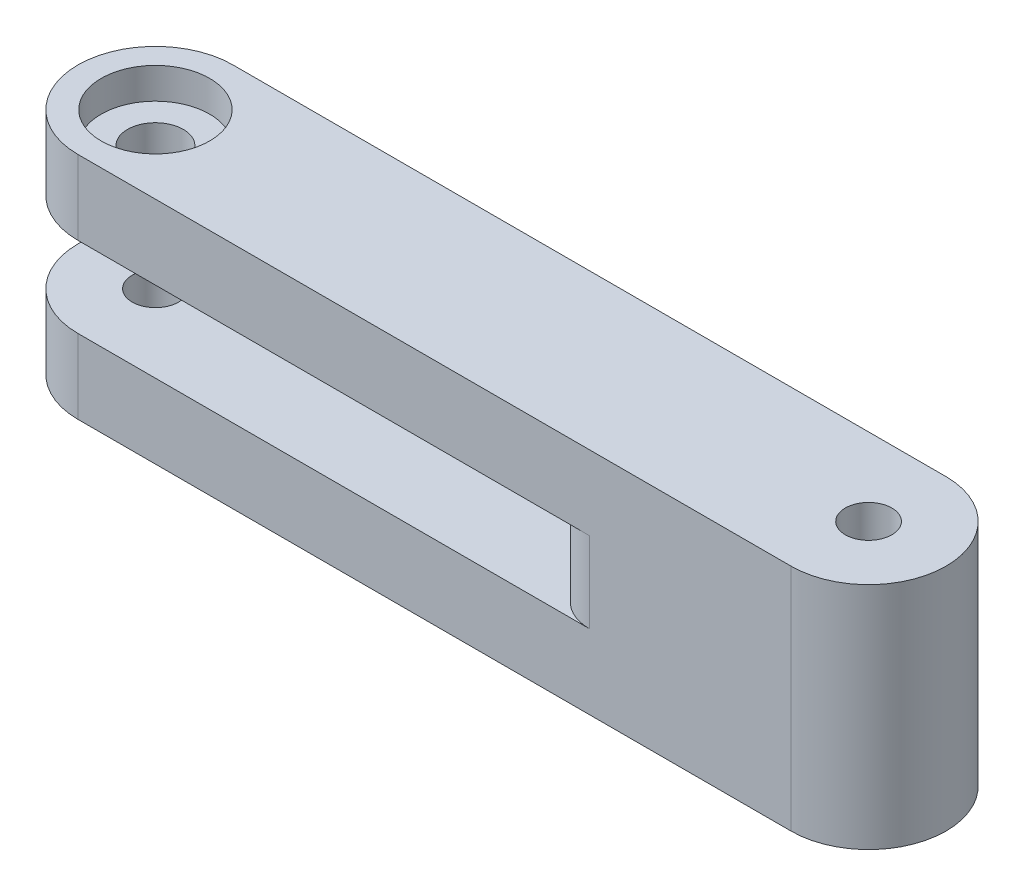
ISO-10303-21;
HEADER;
FILE_DESCRIPTION(('STEP AP214'),'2;1');
FILE_NAME('part.step','',(''),(''),'','','');
FILE_SCHEMA(('AUTOMOTIVE_DESIGN { 1 0 10303 214 1 1 1 1 }'));
ENDSEC;
DATA;
#1=APPLICATION_CONTEXT('core data for automotive mechanical design processes');
#2=APPLICATION_PROTOCOL_DEFINITION('international standard','automotive_design',2000,#1);
#3=PRODUCT_CONTEXT('',#1,'mechanical');
#4=PRODUCT('Part','Part','',(#3));
#5=PRODUCT_RELATED_PRODUCT_CATEGORY('part','',(#4));
#6=PRODUCT_DEFINITION_FORMATION('','',#4);
#7=PRODUCT_DEFINITION_CONTEXT('part definition',#1,'design');
#8=PRODUCT_DEFINITION('design','',#6,#7);
#9=PRODUCT_DEFINITION_SHAPE('','',#8);
#10=(LENGTH_UNIT() NAMED_UNIT(*) SI_UNIT(.MILLI.,.METRE.));
#11=(NAMED_UNIT(*) PLANE_ANGLE_UNIT() SI_UNIT($,.RADIAN.));
#12=(NAMED_UNIT(*) SI_UNIT($,.STERADIAN.) SOLID_ANGLE_UNIT());
#13=UNCERTAINTY_MEASURE_WITH_UNIT(LENGTH_MEASURE(1.E-05),#10,'distance_accuracy_value','');
#14=(GEOMETRIC_REPRESENTATION_CONTEXT(3) GLOBAL_UNCERTAINTY_ASSIGNED_CONTEXT((#13)) GLOBAL_UNIT_ASSIGNED_CONTEXT((#10,
#11,#12)) REPRESENTATION_CONTEXT('',''));
#15=CARTESIAN_POINT('',(0.,0.,0.));
#16=DIRECTION('',(0.,0.,1.));
#17=DIRECTION('',(1.,0.,0.));
#18=AXIS2_PLACEMENT_3D('',#15,#16,#17);
#19=CARTESIAN_POINT('',(-29.21,18.796,0.));
#20=DIRECTION('',(0.,-1.,0.));
#21=DIRECTION('',(0.,0.,-1.));
#22=AXIS2_PLACEMENT_3D('',#19,#20,#21);
#23=CYLINDRICAL_SURFACE('',#22,2.28600000000001);
#24=CARTESIAN_POINT('',(-29.21,12.7,0.));
#25=DIRECTION('',(0.,1.,0.));
#26=DIRECTION('',(0.,0.,1.));
#27=AXIS2_PLACEMENT_3D('',#24,#25,#26);
#28=CIRCLE('',#27,2.28600000000001);
#29=CARTESIAN_POINT('',(-29.21,12.7,2.28600000000001));
#30=VERTEX_POINT('',#29);
#31=EDGE_CURVE('E127',#30,#30,#28,.T.);
#32=ORIENTED_EDGE('',*,*,#31,.F.);
#33=EDGE_LOOP('',(#32));
#34=FACE_BOUND('',#33,.T.);
#35=CARTESIAN_POINT('',(-29.21,16.256,0.));
#36=DIRECTION('',(0.,1.,0.));
#37=DIRECTION('',(0.,0.,1.));
#38=AXIS2_PLACEMENT_3D('',#35,#36,#37);
#39=CIRCLE('',#38,2.28600000000001);
#40=CARTESIAN_POINT('',(-29.21,16.256,2.28600000000001));
#41=VERTEX_POINT('',#40);
#42=EDGE_CURVE('E137',#41,#41,#39,.T.);
#43=ORIENTED_EDGE('',*,*,#42,.T.);
#44=EDGE_LOOP('',(#43));
#45=FACE_BOUND('',#44,.T.);
#46=ADVANCED_FACE('F42',(#34,#45),#23,.F.);
#47=CARTESIAN_POINT('',(-29.21,18.796,0.));
#48=DIRECTION('',(0.,-1.,0.));
#49=DIRECTION('',(0.,0.,-1.));
#50=AXIS2_PLACEMENT_3D('',#47,#48,#49);
#51=CYLINDRICAL_SURFACE('',#50,6.35);
#52=DIRECTION('',(0.,-1.,0.));
#53=VECTOR('',#52,1.);
#54=CARTESIAN_POINT('',(-29.21,18.796,-6.35));
#55=LINE('',#54,#53);
#56=CARTESIAN_POINT('',(-29.21,18.796,-6.35));
#57=VERTEX_POINT('',#56);
#58=CARTESIAN_POINT('',(-29.21,12.7,-6.35000000000001));
#59=VERTEX_POINT('',#58);
#60=EDGE_CURVE('E240',#57,#59,#55,.T.);
#61=ORIENTED_EDGE('',*,*,#60,.T.);
#62=CARTESIAN_POINT('',(-29.21,12.7,0.));
#63=DIRECTION('',(0.,1.,0.));
#64=DIRECTION('',(0.,0.,1.));
#65=AXIS2_PLACEMENT_3D('',#62,#63,#64);
#66=CIRCLE('',#65,6.35);
#67=CARTESIAN_POINT('',(-29.21,12.7,6.34999999999999));
#68=VERTEX_POINT('',#67);
#69=EDGE_CURVE('E158',#59,#68,#66,.T.);
#70=ORIENTED_EDGE('',*,*,#69,.T.);
#71=DIRECTION('',(0.,-1.,0.));
#72=VECTOR('',#71,1.);
#73=CARTESIAN_POINT('',(-29.21,18.796,6.35));
#74=LINE('',#73,#72);
#75=CARTESIAN_POINT('',(-29.21,18.796,6.35));
#76=VERTEX_POINT('',#75);
#77=EDGE_CURVE('E144',#76,#68,#74,.T.);
#78=ORIENTED_EDGE('',*,*,#77,.F.);
#79=CARTESIAN_POINT('',(-29.21,18.796,0.));
#80=DIRECTION('',(0.,1.,0.));
#81=DIRECTION('',(0.,0.,1.));
#82=AXIS2_PLACEMENT_3D('',#79,#80,#81);
#83=CIRCLE('',#82,6.35);
#84=EDGE_CURVE('E214',#57,#76,#83,.T.);
#85=ORIENTED_EDGE('',*,*,#84,.F.);
#86=EDGE_LOOP('',(#61,#70,#78,#85));
#87=FACE_BOUND('',#86,.T.);
#88=ADVANCED_FACE('F265',(#87),#51,.T.);
#89=CARTESIAN_POINT('',(-29.21,18.796,0.));
#90=DIRECTION('',(0.,1.,0.));
#91=DIRECTION('',(0.,0.,1.));
#92=AXIS2_PLACEMENT_3D('',#89,#90,#91);
#93=PLANE('',#92);
#94=CARTESIAN_POINT('',(-29.21,18.796,0.));
#95=DIRECTION('',(0.,1.,0.));
#96=DIRECTION('',(0.,0.,1.));
#97=AXIS2_PLACEMENT_3D('',#94,#95,#96);
#98=CIRCLE('',#97,4.445);
#99=CARTESIAN_POINT('',(-29.21,18.796,4.445));
#100=VERTEX_POINT('',#99);
#101=EDGE_CURVE('E461',#100,#100,#98,.T.);
#102=ORIENTED_EDGE('',*,*,#101,.F.);
#103=EDGE_LOOP('',(#102));
#104=FACE_BOUND('',#103,.T.);
#105=ORIENTED_EDGE('',*,*,#84,.T.);
#106=DIRECTION('',(1.,0.,0.));
#107=VECTOR('',#106,1.);
#108=CARTESIAN_POINT('',(-29.21,18.796,6.35));
#109=LINE('',#108,#107);
#110=CARTESIAN_POINT('',(29.21,18.796,6.34999999999999));
#111=VERTEX_POINT('',#110);
#112=EDGE_CURVE('E218',#76,#111,#109,.T.);
#113=ORIENTED_EDGE('',*,*,#112,.T.);
#114=CARTESIAN_POINT('',(29.21,18.796,0.));
#115=DIRECTION('',(0.,1.,0.));
#116=DIRECTION('',(0.,0.,1.));
#117=AXIS2_PLACEMENT_3D('',#114,#115,#116);
#118=CIRCLE('',#117,6.35);
#119=CARTESIAN_POINT('',(29.21,18.796,-6.35000000000001));
#120=VERTEX_POINT('',#119);
#121=EDGE_CURVE('E222',#111,#120,#118,.T.);
#122=ORIENTED_EDGE('',*,*,#121,.T.);
#123=DIRECTION('',(-1.,0.,0.));
#124=VECTOR('',#123,1.);
#125=CARTESIAN_POINT('',(-29.21,18.796,-6.35));
#126=LINE('',#125,#124);
#127=EDGE_CURVE('E225',#120,#57,#126,.T.);
#128=ORIENTED_EDGE('',*,*,#127,.T.);
#129=EDGE_LOOP('',(#105,#113,#122,#128));
#130=FACE_BOUND('',#129,.T.);
#131=CARTESIAN_POINT('',(29.21,18.796,0.));
#132=DIRECTION('',(0.,1.,0.));
#133=DIRECTION('',(0.,0.,1.));
#134=AXIS2_PLACEMENT_3D('',#131,#132,#133);
#135=CIRCLE('',#134,1.905);
#136=CARTESIAN_POINT('',(29.21,18.796,1.90499999999999));
#137=VERTEX_POINT('',#136);
#138=EDGE_CURVE('E207',#137,#137,#135,.T.);
#139=ORIENTED_EDGE('',*,*,#138,.F.);
#140=EDGE_LOOP('',(#139));
#141=FACE_BOUND('',#140,.T.);
#142=ADVANCED_FACE('F260',(#104,#130,#141),#93,.T.);
#143=CARTESIAN_POINT('',(-29.21,0.,0.));
#144=DIRECTION('',(0.,1.,0.));
#145=DIRECTION('',(0.,0.,1.));
#146=AXIS2_PLACEMENT_3D('',#143,#144,#145);
#147=PLANE('',#146);
#148=CARTESIAN_POINT('',(-29.21,0.,0.));
#149=DIRECTION('',(0.,1.,0.));
#150=DIRECTION('',(0.,0.,1.));
#151=AXIS2_PLACEMENT_3D('',#148,#149,#150);
#152=CIRCLE('',#151,6.35);
#153=CARTESIAN_POINT('',(-29.21,0.,-6.35));
#154=VERTEX_POINT('',#153);
#155=CARTESIAN_POINT('',(-29.21,0.,6.35));
#156=VERTEX_POINT('',#155);
#157=EDGE_CURVE('E142',#154,#156,#152,.T.);
#158=ORIENTED_EDGE('',*,*,#157,.F.);
#159=DIRECTION('',(-1.,0.,0.));
#160=VECTOR('',#159,1.);
#161=CARTESIAN_POINT('',(-29.21,0.,-6.35));
#162=LINE('',#161,#160);
#163=CARTESIAN_POINT('',(29.21,0.,-6.35000000000001));
#164=VERTEX_POINT('',#163);
#165=EDGE_CURVE('E219',#164,#154,#162,.T.);
#166=ORIENTED_EDGE('',*,*,#165,.F.);
#167=CARTESIAN_POINT('',(29.21,0.,0.));
#168=DIRECTION('',(0.,1.,0.));
#169=DIRECTION('',(0.,0.,1.));
#170=AXIS2_PLACEMENT_3D('',#167,#168,#169);
#171=CIRCLE('',#170,6.35);
#172=CARTESIAN_POINT('',(29.21,0.,6.34999999999999));
#173=VERTEX_POINT('',#172);
#174=EDGE_CURVE('E234',#173,#164,#171,.T.);
#175=ORIENTED_EDGE('',*,*,#174,.F.);
#176=DIRECTION('',(1.,0.,0.));
#177=VECTOR('',#176,1.);
#178=CARTESIAN_POINT('',(-29.21,0.,6.35));
#179=LINE('',#178,#177);
#180=EDGE_CURVE('E231',#156,#173,#179,.T.);
#181=ORIENTED_EDGE('',*,*,#180,.F.);
#182=EDGE_LOOP('',(#158,#166,#175,#181));
#183=FACE_BOUND('',#182,.T.);
#184=CARTESIAN_POINT('',(29.21,0.,0.));
#185=DIRECTION('',(0.,1.,0.));
#186=DIRECTION('',(0.,0.,1.));
#187=AXIS2_PLACEMENT_3D('',#184,#185,#186);
#188=CIRCLE('',#187,1.905);
#189=CARTESIAN_POINT('',(29.21,0.,1.90499999999999));
#190=VERTEX_POINT('',#189);
#191=EDGE_CURVE('E206',#190,#190,#188,.T.);
#192=ORIENTED_EDGE('',*,*,#191,.T.);
#193=EDGE_LOOP('',(#192));
#194=FACE_BOUND('',#193,.T.);
#195=CARTESIAN_POINT('',(-29.21,0.,0.));
#196=DIRECTION('',(0.,1.,0.));
#197=DIRECTION('',(0.,0.,1.));
#198=AXIS2_PLACEMENT_3D('',#195,#196,#197);
#199=CIRCLE('',#198,1.905);
#200=CARTESIAN_POINT('',(-29.21,0.,1.905));
#201=VERTEX_POINT('',#200);
#202=EDGE_CURVE('E465',#201,#201,#199,.F.);
#203=ORIENTED_EDGE('',*,*,#202,.F.);
#204=EDGE_LOOP('',(#203));
#205=FACE_BOUND('',#204,.T.);
#206=ADVANCED_FACE('F255',(#183,#194,#205),#147,.F.);
#207=CARTESIAN_POINT('',(-29.21,6.096,6.34999999999999));
#208=VERTEX_POINT('',#207);
#209=EDGE_CURVE('E131',#208,#156,#74,.T.);
#210=ORIENTED_EDGE('',*,*,#209,.F.);
#211=CARTESIAN_POINT('',(-29.21,6.096,0.));
#212=DIRECTION('',(0.,-1.,0.));
#213=DIRECTION('',(1.,0.,0.));
#214=AXIS2_PLACEMENT_3D('',#211,#212,#213);
#215=CIRCLE('',#214,6.35);
#216=CARTESIAN_POINT('',(-29.21,6.096,-6.35000000000001));
#217=VERTEX_POINT('',#216);
#218=EDGE_CURVE('E118',#208,#217,#215,.T.);
#219=ORIENTED_EDGE('',*,*,#218,.T.);
#220=EDGE_CURVE('E228',#217,#154,#55,.T.);
#221=ORIENTED_EDGE('',*,*,#220,.T.);
#222=ORIENTED_EDGE('',*,*,#157,.T.);
#223=EDGE_LOOP('',(#210,#219,#221,#222));
#224=FACE_BOUND('',#223,.T.);
#225=ADVANCED_FACE('F140',(#224),#51,.T.);
#226=CARTESIAN_POINT('',(-29.21,18.796,6.35));
#227=DIRECTION('',(0.,0.,-1.));
#228=DIRECTION('',(-1.,0.,0.));
#229=AXIS2_PLACEMENT_3D('',#226,#227,#228);
#230=PLANE('',#229);
#231=DIRECTION('',(-1.,0.,0.));
#232=VECTOR('',#231,1.);
#233=CARTESIAN_POINT('',(-35.56,12.7,6.34999999999999));
#234=LINE('',#233,#232);
#235=CARTESIAN_POINT('',(12.7,12.7,6.34999999999999));
#236=VERTEX_POINT('',#235);
#237=EDGE_CURVE('E58',#236,#68,#234,.T.);
#238=ORIENTED_EDGE('',*,*,#237,.F.);
#239=DIRECTION('',(0.,1.,0.));
#240=VECTOR('',#239,1.);
#241=CARTESIAN_POINT('',(12.7,18.796,6.34999999999999));
#242=LINE('',#241,#240);
#243=CARTESIAN_POINT('',(12.7,6.096,6.34999999999999));
#244=VERTEX_POINT('',#243);
#245=EDGE_CURVE('E134',#236,#244,#242,.F.);
#246=ORIENTED_EDGE('',*,*,#245,.T.);
#247=DIRECTION('',(1.,0.,0.));
#248=VECTOR('',#247,1.);
#249=CARTESIAN_POINT('',(-35.56,6.096,6.34999999999999));
#250=LINE('',#249,#248);
#251=EDGE_CURVE('E65',#208,#244,#250,.T.);
#252=ORIENTED_EDGE('',*,*,#251,.F.);
#253=ORIENTED_EDGE('',*,*,#209,.T.);
#254=ORIENTED_EDGE('',*,*,#180,.T.);
#255=DIRECTION('',(0.,-1.,0.));
#256=VECTOR('',#255,1.);
#257=CARTESIAN_POINT('',(29.21,18.796,6.34999999999999));
#258=LINE('',#257,#256);
#259=EDGE_CURVE('E145',#111,#173,#258,.T.);
#260=ORIENTED_EDGE('',*,*,#259,.F.);
#261=ORIENTED_EDGE('',*,*,#112,.F.);
#262=ORIENTED_EDGE('',*,*,#77,.T.);
#263=EDGE_LOOP('',(#238,#246,#252,#253,#254,#260,#261,#262));
#264=FACE_BOUND('',#263,.T.);
#265=ADVANCED_FACE('F130',(#264),#230,.F.);
#266=CARTESIAN_POINT('',(29.21,18.796,0.));
#267=DIRECTION('',(0.,-1.,0.));
#268=DIRECTION('',(0.,0.,-1.));
#269=AXIS2_PLACEMENT_3D('',#266,#267,#268);
#270=CYLINDRICAL_SURFACE('',#269,6.35);
#271=ORIENTED_EDGE('',*,*,#174,.T.);
#272=DIRECTION('',(0.,-1.,0.));
#273=VECTOR('',#272,1.);
#274=CARTESIAN_POINT('',(29.21,18.796,-6.35000000000001));
#275=LINE('',#274,#273);
#276=EDGE_CURVE('E151',#120,#164,#275,.T.);
#277=ORIENTED_EDGE('',*,*,#276,.F.);
#278=ORIENTED_EDGE('',*,*,#121,.F.);
#279=ORIENTED_EDGE('',*,*,#259,.T.);
#280=EDGE_LOOP('',(#271,#277,#278,#279));
#281=FACE_BOUND('',#280,.T.);
#282=ADVANCED_FACE('F258',(#281),#270,.T.);
#283=CARTESIAN_POINT('',(-29.21,18.796,-6.35));
#284=DIRECTION('',(0.,0.,1.));
#285=DIRECTION('',(1.,0.,0.));
#286=AXIS2_PLACEMENT_3D('',#283,#284,#285);
#287=PLANE('',#286);
#288=DIRECTION('',(0.,1.,0.));
#289=VECTOR('',#288,1.);
#290=CARTESIAN_POINT('',(12.7,18.796,-6.35000000000001));
#291=LINE('',#290,#289);
#292=CARTESIAN_POINT('',(12.7,6.096,-6.35000000000001));
#293=VERTEX_POINT('',#292);
#294=CARTESIAN_POINT('',(12.7,12.7,-6.35000000000001));
#295=VERTEX_POINT('',#294);
#296=EDGE_CURVE('E149',#293,#295,#291,.T.);
#297=ORIENTED_EDGE('',*,*,#296,.T.);
#298=DIRECTION('',(-1.,0.,0.));
#299=VECTOR('',#298,1.);
#300=CARTESIAN_POINT('',(-35.56,12.7,-6.35000000000001));
#301=LINE('',#300,#299);
#302=EDGE_CURVE('E195',#295,#59,#301,.T.);
#303=ORIENTED_EDGE('',*,*,#302,.T.);
#304=ORIENTED_EDGE('',*,*,#60,.F.);
#305=ORIENTED_EDGE('',*,*,#127,.F.);
#306=ORIENTED_EDGE('',*,*,#276,.T.);
#307=ORIENTED_EDGE('',*,*,#165,.T.);
#308=ORIENTED_EDGE('',*,*,#220,.F.);
#309=DIRECTION('',(1.,0.,0.));
#310=VECTOR('',#309,1.);
#311=CARTESIAN_POINT('',(-35.56,6.096,-6.35000000000001));
#312=LINE('',#311,#310);
#313=EDGE_CURVE('E122',#217,#293,#312,.T.);
#314=ORIENTED_EDGE('',*,*,#313,.T.);
#315=EDGE_LOOP('',(#297,#303,#304,#305,#306,#307,#308,#314));
#316=FACE_BOUND('',#315,.T.);
#317=ADVANCED_FACE('F249',(#316),#287,.F.);
#318=CARTESIAN_POINT('',(29.21,18.796,0.));
#319=DIRECTION('',(0.,-1.,0.));
#320=DIRECTION('',(0.,0.,-1.));
#321=AXIS2_PLACEMENT_3D('',#318,#319,#320);
#322=CYLINDRICAL_SURFACE('',#321,1.905);
#323=ORIENTED_EDGE('',*,*,#138,.T.);
#324=EDGE_LOOP('',(#323));
#325=FACE_BOUND('',#324,.T.);
#326=ORIENTED_EDGE('',*,*,#191,.F.);
#327=EDGE_LOOP('',(#326));
#328=FACE_BOUND('',#327,.T.);
#329=ADVANCED_FACE('F290',(#325,#328),#322,.F.);
#330=CARTESIAN_POINT('',(-35.56,12.7,-6.35000000000001));
#331=DIRECTION('',(0.,1.,0.));
#332=DIRECTION('',(0.,0.,1.));
#333=AXIS2_PLACEMENT_3D('',#330,#331,#332);
#334=PLANE('',#333);
#335=ORIENTED_EDGE('',*,*,#31,.T.);
#336=EDGE_LOOP('',(#335));
#337=FACE_BOUND('',#336,.T.);
#338=ORIENTED_EDGE('',*,*,#302,.F.);
#339=CARTESIAN_POINT('',(12.7,12.7,-2.54000000000001));
#340=DIRECTION('',(0.,1.,0.));
#341=DIRECTION('',(0.,0.,1.));
#342=AXIS2_PLACEMENT_3D('',#339,#340,#341);
#343=CIRCLE('',#342,3.81);
#344=CARTESIAN_POINT('',(8.89,12.7,-2.54000000000001));
#345=VERTEX_POINT('',#344);
#346=EDGE_CURVE('E175',#295,#345,#343,.T.);
#347=ORIENTED_EDGE('',*,*,#346,.T.);
#348=DIRECTION('',(0.,0.,1.));
#349=VECTOR('',#348,1.);
#350=CARTESIAN_POINT('',(8.89,12.7,-6.35000000000001));
#351=LINE('',#350,#349);
#352=CARTESIAN_POINT('',(8.89,12.7,2.53999999999999));
#353=VERTEX_POINT('',#352);
#354=EDGE_CURVE('E128',#345,#353,#351,.T.);
#355=ORIENTED_EDGE('',*,*,#354,.T.);
#356=CARTESIAN_POINT('',(12.7,12.7,2.53999999999999));
#357=DIRECTION('',(0.,1.,0.));
#358=DIRECTION('',(0.,0.,1.));
#359=AXIS2_PLACEMENT_3D('',#356,#357,#358);
#360=CIRCLE('',#359,3.81);
#361=EDGE_CURVE('E51',#353,#236,#360,.T.);
#362=ORIENTED_EDGE('',*,*,#361,.T.);
#363=ORIENTED_EDGE('',*,*,#237,.T.);
#364=ORIENTED_EDGE('',*,*,#69,.F.);
#365=EDGE_LOOP('',(#338,#347,#355,#362,#363,#364));
#366=FACE_BOUND('',#365,.T.);
#367=ADVANCED_FACE('F183',(#337,#366),#334,.F.);
#368=CARTESIAN_POINT('',(-35.56,6.096,-6.35000000000001));
#369=DIRECTION('',(0.,-1.,0.));
#370=DIRECTION('',(1.,0.,0.));
#371=AXIS2_PLACEMENT_3D('',#368,#369,#370);
#372=PLANE('',#371);
#373=ORIENTED_EDGE('',*,*,#251,.T.);
#374=CARTESIAN_POINT('',(12.7,6.096,2.53999999999999));
#375=DIRECTION('',(0.,-1.,0.));
#376=DIRECTION('',(1.,0.,0.));
#377=AXIS2_PLACEMENT_3D('',#374,#375,#376);
#378=CIRCLE('',#377,3.81);
#379=CARTESIAN_POINT('',(8.89,6.096,2.53999999999999));
#380=VERTEX_POINT('',#379);
#381=EDGE_CURVE('E11',#244,#380,#378,.T.);
#382=ORIENTED_EDGE('',*,*,#381,.T.);
#383=DIRECTION('',(0.,0.,1.));
#384=VECTOR('',#383,1.);
#385=CARTESIAN_POINT('',(8.89,6.096,-6.35000000000001));
#386=LINE('',#385,#384);
#387=CARTESIAN_POINT('',(8.89,6.096,-2.54000000000001));
#388=VERTEX_POINT('',#387);
#389=EDGE_CURVE('E189',#388,#380,#386,.T.);
#390=ORIENTED_EDGE('',*,*,#389,.F.);
#391=CARTESIAN_POINT('',(12.7,6.096,-2.54000000000001));
#392=DIRECTION('',(0.,-1.,0.));
#393=DIRECTION('',(1.,0.,0.));
#394=AXIS2_PLACEMENT_3D('',#391,#392,#393);
#395=CIRCLE('',#394,3.81);
#396=EDGE_CURVE('E178',#388,#293,#395,.T.);
#397=ORIENTED_EDGE('',*,*,#396,.T.);
#398=ORIENTED_EDGE('',*,*,#313,.F.);
#399=ORIENTED_EDGE('',*,*,#218,.F.);
#400=EDGE_LOOP('',(#373,#382,#390,#397,#398,#399));
#401=FACE_BOUND('',#400,.T.);
#402=CARTESIAN_POINT('',(-29.21,6.096,0.));
#403=DIRECTION('',(0.,1.,0.));
#404=DIRECTION('',(-1.,0.,0.));
#405=AXIS2_PLACEMENT_3D('',#402,#403,#404);
#406=CIRCLE('',#405,1.905);
#407=CARTESIAN_POINT('',(-31.115,6.096,0.));
#408=VERTEX_POINT('',#407);
#409=EDGE_CURVE('E474',#408,#408,#406,.T.);
#410=ORIENTED_EDGE('',*,*,#409,.F.);
#411=EDGE_LOOP('',(#410));
#412=FACE_BOUND('',#411,.T.);
#413=ADVANCED_FACE('F119',(#401,#412),#372,.F.);
#414=CARTESIAN_POINT('',(8.89,12.7,-6.35000000000001));
#415=DIRECTION('',(1.,0.,0.));
#416=DIRECTION('',(0.,0.,-1.));
#417=AXIS2_PLACEMENT_3D('',#414,#415,#416);
#418=PLANE('',#417);
#419=ORIENTED_EDGE('',*,*,#354,.F.);
#420=DIRECTION('',(0.,1.,0.));
#421=VECTOR('',#420,1.);
#422=CARTESIAN_POINT('',(8.89,12.7,-2.54000000000001));
#423=LINE('',#422,#421);
#424=EDGE_CURVE('E170',#345,#388,#423,.F.);
#425=ORIENTED_EDGE('',*,*,#424,.T.);
#426=ORIENTED_EDGE('',*,*,#389,.T.);
#427=DIRECTION('',(0.,1.,0.));
#428=VECTOR('',#427,1.);
#429=CARTESIAN_POINT('',(8.89,12.7,2.53999999999999));
#430=LINE('',#429,#428);
#431=EDGE_CURVE('E166',#380,#353,#430,.T.);
#432=ORIENTED_EDGE('',*,*,#431,.T.);
#433=EDGE_LOOP('',(#419,#425,#426,#432));
#434=FACE_BOUND('',#433,.T.);
#435=ADVANCED_FACE('F192',(#434),#418,.F.);
#436=CARTESIAN_POINT('',(-29.21,16.256,0.));
#437=DIRECTION('',(0.,1.,0.));
#438=DIRECTION('',(0.,0.,1.));
#439=AXIS2_PLACEMENT_3D('',#436,#437,#438);
#440=CYLINDRICAL_SURFACE('',#439,4.445);
#441=CARTESIAN_POINT('',(-29.21,16.256,0.));
#442=DIRECTION('',(0.,1.,0.));
#443=DIRECTION('',(0.,0.,1.));
#444=AXIS2_PLACEMENT_3D('',#441,#442,#443);
#445=CIRCLE('',#444,4.445);
#446=CARTESIAN_POINT('',(-29.21,16.256,4.445));
#447=VERTEX_POINT('',#446);
#448=EDGE_CURVE('E162',#447,#447,#445,.T.);
#449=ORIENTED_EDGE('',*,*,#448,.F.);
#450=EDGE_LOOP('',(#449));
#451=FACE_BOUND('',#450,.T.);
#452=ORIENTED_EDGE('',*,*,#101,.T.);
#453=EDGE_LOOP('',(#452));
#454=FACE_BOUND('',#453,.T.);
#455=ADVANCED_FACE('F361',(#451,#454),#440,.F.);
#456=CARTESIAN_POINT('',(-29.21,16.256,0.));
#457=DIRECTION('',(0.,1.,0.));
#458=DIRECTION('',(0.,0.,1.));
#459=AXIS2_PLACEMENT_3D('',#456,#457,#458);
#460=PLANE('',#459);
#461=ORIENTED_EDGE('',*,*,#42,.F.);
#462=EDGE_LOOP('',(#461));
#463=FACE_BOUND('',#462,.T.);
#464=ORIENTED_EDGE('',*,*,#448,.T.);
#465=EDGE_LOOP('',(#464));
#466=FACE_BOUND('',#465,.T.);
#467=ADVANCED_FACE('F276',(#463,#466),#460,.T.);
#468=CARTESIAN_POINT('',(-29.21,-6.46578440716981,0.));
#469=DIRECTION('',(0.,1.,0.));
#470=DIRECTION('',(-1.,0.,0.));
#471=AXIS2_PLACEMENT_3D('',#468,#469,#470);
#472=CYLINDRICAL_SURFACE('',#471,1.905);
#473=ORIENTED_EDGE('',*,*,#202,.T.);
#474=EDGE_LOOP('',(#473));
#475=FACE_BOUND('',#474,.T.);
#476=ORIENTED_EDGE('',*,*,#409,.T.);
#477=EDGE_LOOP('',(#476));
#478=FACE_BOUND('',#477,.T.);
#479=ADVANCED_FACE('F271',(#475,#478),#472,.F.);
#480=CARTESIAN_POINT('',(12.7,18.796,-2.54000000000001));
#481=DIRECTION('',(0.,1.,0.));
#482=DIRECTION('',(0.,0.,1.));
#483=AXIS2_PLACEMENT_3D('',#480,#481,#482);
#484=CYLINDRICAL_SURFACE('',#483,3.81);
#485=ORIENTED_EDGE('',*,*,#396,.F.);
#486=ORIENTED_EDGE('',*,*,#424,.F.);
#487=ORIENTED_EDGE('',*,*,#346,.F.);
#488=ORIENTED_EDGE('',*,*,#296,.F.);
#489=EDGE_LOOP('',(#485,#486,#487,#488));
#490=FACE_BOUND('',#489,.T.);
#491=ADVANCED_FACE('F269',(#490),#484,.T.);
#492=CARTESIAN_POINT('',(12.7,12.7,2.53999999999999));
#493=DIRECTION('',(0.,1.,0.));
#494=DIRECTION('',(0.,0.,1.));
#495=AXIS2_PLACEMENT_3D('',#492,#493,#494);
#496=CYLINDRICAL_SURFACE('',#495,3.81);
#497=ORIENTED_EDGE('',*,*,#381,.F.);
#498=ORIENTED_EDGE('',*,*,#245,.F.);
#499=ORIENTED_EDGE('',*,*,#361,.F.);
#500=ORIENTED_EDGE('',*,*,#431,.F.);
#501=EDGE_LOOP('',(#497,#498,#499,#500));
#502=FACE_BOUND('',#501,.T.);
#503=ADVANCED_FACE('F44',(#502),#496,.T.);
#504=CLOSED_SHELL('',(#46,#88,#142,#206,#225,#265,#282,#317,#329,#367,#413,#435,#455,#467,#479,
#491,#503));
#505=MANIFOLD_SOLID_BREP('B2',#504);
#506=ADVANCED_BREP_SHAPE_REPRESENTATION('',(#18,#505),#14);
#507=SHAPE_DEFINITION_REPRESENTATION(#9,#506);
ENDSEC;
END-ISO-10303-21;
